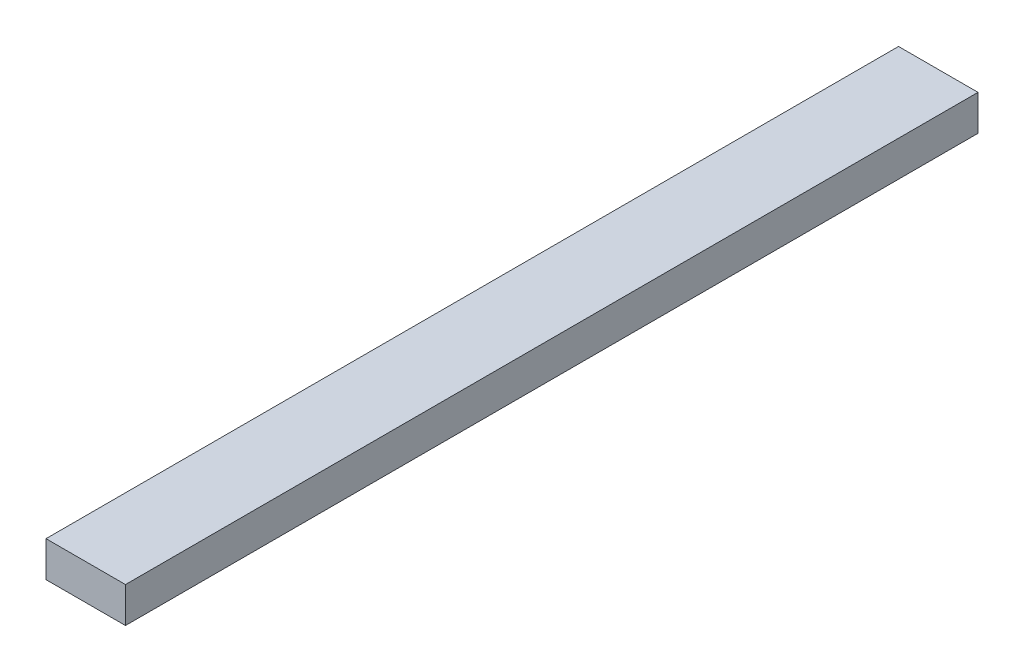
ISO-10303-21;
HEADER;
FILE_DESCRIPTION(('STEP AP214'),'2;1');
FILE_NAME('part.step','',(''),(''),'','','');
FILE_SCHEMA(('AUTOMOTIVE_DESIGN { 1 0 10303 214 1 1 1 1 }'));
ENDSEC;
DATA;
#1=APPLICATION_CONTEXT('core data for automotive mechanical design processes');
#2=APPLICATION_PROTOCOL_DEFINITION('international standard','automotive_design',2000,#1);
#3=PRODUCT_CONTEXT('',#1,'mechanical');
#4=PRODUCT('Part','Part','',(#3));
#5=PRODUCT_RELATED_PRODUCT_CATEGORY('part','',(#4));
#6=PRODUCT_DEFINITION_FORMATION('','',#4);
#7=PRODUCT_DEFINITION_CONTEXT('part definition',#1,'design');
#8=PRODUCT_DEFINITION('design','',#6,#7);
#9=PRODUCT_DEFINITION_SHAPE('','',#8);
#10=(LENGTH_UNIT() NAMED_UNIT(*) SI_UNIT(.MILLI.,.METRE.));
#11=(NAMED_UNIT(*) PLANE_ANGLE_UNIT() SI_UNIT($,.RADIAN.));
#12=(NAMED_UNIT(*) SI_UNIT($,.STERADIAN.) SOLID_ANGLE_UNIT());
#13=UNCERTAINTY_MEASURE_WITH_UNIT(LENGTH_MEASURE(1.E-05),#10,'distance_accuracy_value','');
#14=(GEOMETRIC_REPRESENTATION_CONTEXT(3) GLOBAL_UNCERTAINTY_ASSIGNED_CONTEXT((#13)) GLOBAL_UNIT_ASSIGNED_CONTEXT((#10,
#11,#12)) REPRESENTATION_CONTEXT('',''));
#15=CARTESIAN_POINT('',(0.,0.,0.));
#16=DIRECTION('',(0.,0.,1.));
#17=DIRECTION('',(1.,0.,0.));
#18=AXIS2_PLACEMENT_3D('',#15,#16,#17);
#19=CARTESIAN_POINT('',(18.6436,8.3312,200.));
#20=DIRECTION('',(0.,-1.,0.));
#21=DIRECTION('',(0.,0.,-1.));
#22=AXIS2_PLACEMENT_3D('',#19,#20,#21);
#23=PLANE('',#22);
#24=DIRECTION('',(-1.,0.,0.));
#25=VECTOR('',#24,1.);
#26=CARTESIAN_POINT('',(18.6436,8.3312,-200.));
#27=LINE('',#26,#25);
#28=CARTESIAN_POINT('',(18.6436,8.3312,-200.));
#29=VERTEX_POINT('',#28);
#30=CARTESIAN_POINT('',(-18.6436,8.3312,-200.));
#31=VERTEX_POINT('',#30);
#32=EDGE_CURVE('E104',#29,#31,#27,.T.);
#33=ORIENTED_EDGE('',*,*,#32,.T.);
#34=DIRECTION('',(0.,0.,-1.));
#35=VECTOR('',#34,1.);
#36=CARTESIAN_POINT('',(-18.6436,8.3312,200.));
#37=LINE('',#36,#35);
#38=CARTESIAN_POINT('',(-18.6436,8.3312,200.));
#39=VERTEX_POINT('',#38);
#40=EDGE_CURVE('E11',#39,#31,#37,.T.);
#41=ORIENTED_EDGE('',*,*,#40,.F.);
#42=DIRECTION('',(-1.,0.,0.));
#43=VECTOR('',#42,1.);
#44=CARTESIAN_POINT('',(18.6436,8.3312,200.));
#45=LINE('',#44,#43);
#46=CARTESIAN_POINT('',(18.6436,8.3312,200.));
#47=VERTEX_POINT('',#46);
#48=EDGE_CURVE('E92',#47,#39,#45,.T.);
#49=ORIENTED_EDGE('',*,*,#48,.F.);
#50=DIRECTION('',(0.,0.,-1.));
#51=VECTOR('',#50,1.);
#52=CARTESIAN_POINT('',(18.6436,8.3312,200.));
#53=LINE('',#52,#51);
#54=EDGE_CURVE('E100',#47,#29,#53,.T.);
#55=ORIENTED_EDGE('',*,*,#54,.T.);
#56=EDGE_LOOP('',(#33,#41,#49,#55));
#57=FACE_BOUND('',#56,.T.);
#58=ADVANCED_FACE('F41',(#57),#23,.F.);
#59=CARTESIAN_POINT('',(-18.6436,-8.3312,200.));
#60=DIRECTION('',(1.,0.,0.));
#61=DIRECTION('',(0.,0.,-1.));
#62=AXIS2_PLACEMENT_3D('',#59,#60,#61);
#63=PLANE('',#62);
#64=DIRECTION('',(0.,-1.,0.));
#65=VECTOR('',#64,1.);
#66=CARTESIAN_POINT('',(-18.6436,-8.3312,-200.));
#67=LINE('',#66,#65);
#68=CARTESIAN_POINT('',(-18.6436,-8.3312,-200.));
#69=VERTEX_POINT('',#68);
#70=EDGE_CURVE('E96',#31,#69,#67,.T.);
#71=ORIENTED_EDGE('',*,*,#70,.T.);
#72=DIRECTION('',(0.,0.,-1.));
#73=VECTOR('',#72,1.);
#74=CARTESIAN_POINT('',(-18.6436,-8.3312,200.));
#75=LINE('',#74,#73);
#76=CARTESIAN_POINT('',(-18.6436,-8.3312,200.));
#77=VERTEX_POINT('',#76);
#78=EDGE_CURVE('E49',#77,#69,#75,.T.);
#79=ORIENTED_EDGE('',*,*,#78,.F.);
#80=DIRECTION('',(0.,-1.,0.));
#81=VECTOR('',#80,1.);
#82=CARTESIAN_POINT('',(-18.6436,-8.3312,200.));
#83=LINE('',#82,#81);
#84=EDGE_CURVE('E87',#39,#77,#83,.T.);
#85=ORIENTED_EDGE('',*,*,#84,.F.);
#86=ORIENTED_EDGE('',*,*,#40,.T.);
#87=EDGE_LOOP('',(#71,#79,#85,#86));
#88=FACE_BOUND('',#87,.T.);
#89=ADVANCED_FACE('F95',(#88),#63,.F.);
#90=CARTESIAN_POINT('',(18.6436,-8.3312,200.));
#91=DIRECTION('',(0.,1.,0.));
#92=DIRECTION('',(0.,0.,1.));
#93=AXIS2_PLACEMENT_3D('',#90,#91,#92);
#94=PLANE('',#93);
#95=DIRECTION('',(1.,0.,0.));
#96=VECTOR('',#95,1.);
#97=CARTESIAN_POINT('',(18.6436,-8.3312,-200.));
#98=LINE('',#97,#96);
#99=CARTESIAN_POINT('',(18.6436,-8.3312,-200.));
#100=VERTEX_POINT('',#99);
#101=EDGE_CURVE('E74',#69,#100,#98,.T.);
#102=ORIENTED_EDGE('',*,*,#101,.T.);
#103=DIRECTION('',(0.,0.,-1.));
#104=VECTOR('',#103,1.);
#105=CARTESIAN_POINT('',(18.6436,-8.3312,200.));
#106=LINE('',#105,#104);
#107=CARTESIAN_POINT('',(18.6436,-8.3312,200.));
#108=VERTEX_POINT('',#107);
#109=EDGE_CURVE('E97',#108,#100,#106,.T.);
#110=ORIENTED_EDGE('',*,*,#109,.F.);
#111=DIRECTION('',(1.,0.,0.));
#112=VECTOR('',#111,1.);
#113=CARTESIAN_POINT('',(18.6436,-8.3312,200.));
#114=LINE('',#113,#112);
#115=EDGE_CURVE('E90',#77,#108,#114,.T.);
#116=ORIENTED_EDGE('',*,*,#115,.F.);
#117=ORIENTED_EDGE('',*,*,#78,.T.);
#118=EDGE_LOOP('',(#102,#110,#116,#117));
#119=FACE_BOUND('',#118,.T.);
#120=ADVANCED_FACE('F98',(#119),#94,.F.);
#121=CARTESIAN_POINT('',(18.6436,-8.3312,200.));
#122=DIRECTION('',(-1.,0.,0.));
#123=DIRECTION('',(0.,0.,1.));
#124=AXIS2_PLACEMENT_3D('',#121,#122,#123);
#125=PLANE('',#124);
#126=DIRECTION('',(0.,1.,0.));
#127=VECTOR('',#126,1.);
#128=CARTESIAN_POINT('',(18.6436,-8.3312,-200.));
#129=LINE('',#128,#127);
#130=EDGE_CURVE('E80',#100,#29,#129,.T.);
#131=ORIENTED_EDGE('',*,*,#130,.T.);
#132=ORIENTED_EDGE('',*,*,#54,.F.);
#133=DIRECTION('',(0.,1.,0.));
#134=VECTOR('',#133,1.);
#135=CARTESIAN_POINT('',(18.6436,-8.3312,200.));
#136=LINE('',#135,#134);
#137=EDGE_CURVE('E57',#108,#47,#136,.T.);
#138=ORIENTED_EDGE('',*,*,#137,.F.);
#139=ORIENTED_EDGE('',*,*,#109,.T.);
#140=EDGE_LOOP('',(#131,#132,#138,#139));
#141=FACE_BOUND('',#140,.T.);
#142=ADVANCED_FACE('F111',(#141),#125,.F.);
#143=CARTESIAN_POINT('',(0.,0.,200.));
#144=DIRECTION('',(0.,0.,-1.));
#145=DIRECTION('',(-1.,0.,0.));
#146=AXIS2_PLACEMENT_3D('',#143,#144,#145);
#147=PLANE('',#146);
#148=ORIENTED_EDGE('',*,*,#48,.T.);
#149=ORIENTED_EDGE('',*,*,#84,.T.);
#150=ORIENTED_EDGE('',*,*,#115,.T.);
#151=ORIENTED_EDGE('',*,*,#137,.T.);
#152=EDGE_LOOP('',(#148,#149,#150,#151));
#153=FACE_BOUND('',#152,.T.);
#154=ADVANCED_FACE('F88',(#153),#147,.F.);
#155=CARTESIAN_POINT('',(0.,0.,-200.));
#156=DIRECTION('',(0.,0.,-1.));
#157=DIRECTION('',(-1.,0.,0.));
#158=AXIS2_PLACEMENT_3D('',#155,#156,#157);
#159=PLANE('',#158);
#160=ORIENTED_EDGE('',*,*,#32,.F.);
#161=ORIENTED_EDGE('',*,*,#130,.F.);
#162=ORIENTED_EDGE('',*,*,#101,.F.);
#163=ORIENTED_EDGE('',*,*,#70,.F.);
#164=EDGE_LOOP('',(#160,#161,#162,#163));
#165=FACE_BOUND('',#164,.T.);
#166=ADVANCED_FACE('F114',(#165),#159,.T.);
#167=CLOSED_SHELL('',(#58,#89,#120,#142,#154,#166));
#168=MANIFOLD_SOLID_BREP('B2',#167);
#169=ADVANCED_BREP_SHAPE_REPRESENTATION('',(#18,#168),#14);
#170=SHAPE_DEFINITION_REPRESENTATION(#9,#169);
ENDSEC;
END-ISO-10303-21;
